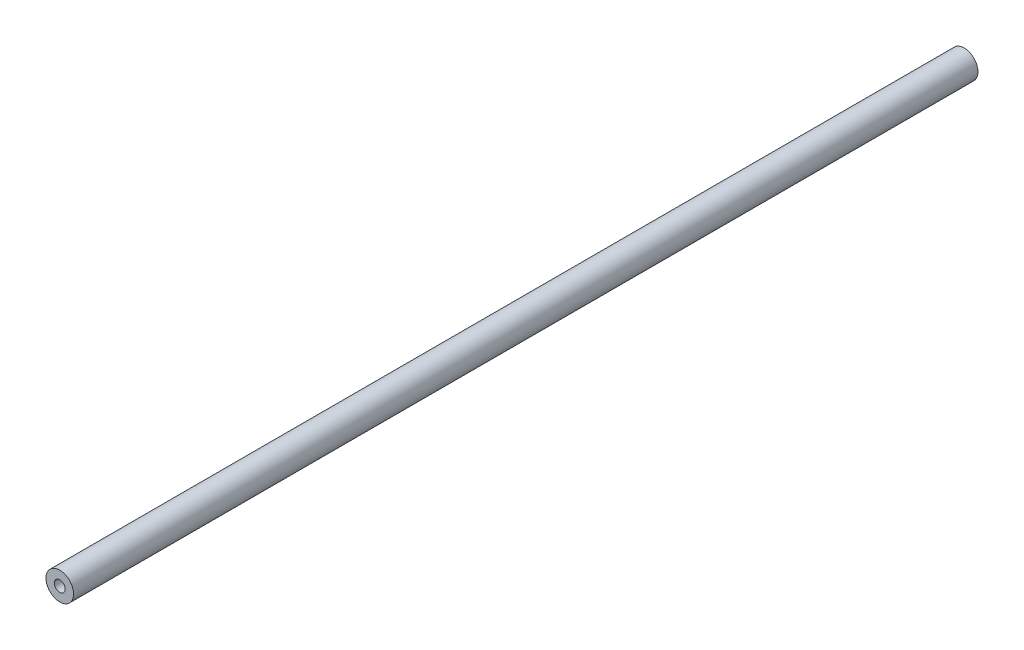
ISO-10303-21;
HEADER;
FILE_DESCRIPTION(('STEP AP214'),'2;1');
FILE_NAME('part.step','',(''),(''),'','','');
FILE_SCHEMA(('AUTOMOTIVE_DESIGN { 1 0 10303 214 1 1 1 1 }'));
ENDSEC;
DATA;
#1=APPLICATION_CONTEXT('core data for automotive mechanical design processes');
#2=APPLICATION_PROTOCOL_DEFINITION('international standard','automotive_design',2000,#1);
#3=PRODUCT_CONTEXT('',#1,'mechanical');
#4=PRODUCT('Part','Part','',(#3));
#5=PRODUCT_RELATED_PRODUCT_CATEGORY('part','',(#4));
#6=PRODUCT_DEFINITION_FORMATION('','',#4);
#7=PRODUCT_DEFINITION_CONTEXT('part definition',#1,'design');
#8=PRODUCT_DEFINITION('design','',#6,#7);
#9=PRODUCT_DEFINITION_SHAPE('','',#8);
#10=(LENGTH_UNIT() NAMED_UNIT(*) SI_UNIT(.MILLI.,.METRE.));
#11=(NAMED_UNIT(*) PLANE_ANGLE_UNIT() SI_UNIT($,.RADIAN.));
#12=(NAMED_UNIT(*) SI_UNIT($,.STERADIAN.) SOLID_ANGLE_UNIT());
#13=UNCERTAINTY_MEASURE_WITH_UNIT(LENGTH_MEASURE(1.E-05),#10,'distance_accuracy_value','');
#14=(GEOMETRIC_REPRESENTATION_CONTEXT(3) GLOBAL_UNCERTAINTY_ASSIGNED_CONTEXT((#13)) GLOBAL_UNIT_ASSIGNED_CONTEXT((#10,
#11,#12)) REPRESENTATION_CONTEXT('',''));
#15=CARTESIAN_POINT('',(0.,0.,0.));
#16=DIRECTION('',(0.,0.,1.));
#17=DIRECTION('',(1.,0.,0.));
#18=AXIS2_PLACEMENT_3D('',#15,#16,#17);
#19=CARTESIAN_POINT('',(0.,0.,416.433));
#20=DIRECTION('',(0.,0.,-1.));
#21=DIRECTION('',(-1.,0.,0.));
#22=AXIS2_PLACEMENT_3D('',#19,#20,#21);
#23=CYLINDRICAL_SURFACE('',#22,6.35);
#24=CARTESIAN_POINT('',(0.,0.,416.433));
#25=DIRECTION('',(0.,0.,1.));
#26=DIRECTION('',(1.,0.,0.));
#27=AXIS2_PLACEMENT_3D('',#24,#25,#26);
#28=CIRCLE('',#27,6.35);
#29=CARTESIAN_POINT('',(6.35,0.,416.433));
#30=VERTEX_POINT('',#29);
#31=EDGE_CURVE('E10',#30,#30,#28,.T.);
#32=ORIENTED_EDGE('',*,*,#31,.F.);
#33=EDGE_LOOP('',(#32));
#34=FACE_BOUND('',#33,.T.);
#35=CARTESIAN_POINT('',(0.,0.,0.));
#36=DIRECTION('',(0.,0.,1.));
#37=DIRECTION('',(1.,0.,0.));
#38=AXIS2_PLACEMENT_3D('',#35,#36,#37);
#39=CIRCLE('',#38,6.35);
#40=CARTESIAN_POINT('',(6.35,0.,0.));
#41=VERTEX_POINT('',#40);
#42=EDGE_CURVE('E34',#41,#41,#39,.T.);
#43=ORIENTED_EDGE('',*,*,#42,.T.);
#44=EDGE_LOOP('',(#43));
#45=FACE_BOUND('',#44,.T.);
#46=ADVANCED_FACE('F31',(#34,#45),#23,.T.);
#47=CARTESIAN_POINT('',(0.,0.,416.433));
#48=DIRECTION('',(0.,0.,1.));
#49=DIRECTION('',(1.,0.,0.));
#50=AXIS2_PLACEMENT_3D('',#47,#48,#49);
#51=PLANE('',#50);
#52=CARTESIAN_POINT('',(0.,0.,416.433));
#53=DIRECTION('',(0.,0.,1.));
#54=DIRECTION('',(1.,0.,0.));
#55=AXIS2_PLACEMENT_3D('',#52,#53,#54);
#56=CIRCLE('',#55,2.5);
#57=CARTESIAN_POINT('',(2.49999999999999,0.,416.433));
#58=VERTEX_POINT('',#57);
#59=EDGE_CURVE('E45',#58,#58,#56,.T.);
#60=ORIENTED_EDGE('',*,*,#59,.F.);
#61=EDGE_LOOP('',(#60));
#62=FACE_BOUND('',#61,.T.);
#63=ORIENTED_EDGE('',*,*,#31,.T.);
#64=EDGE_LOOP('',(#63));
#65=FACE_BOUND('',#64,.T.);
#66=ADVANCED_FACE('F51',(#62,#65),#51,.T.);
#67=CARTESIAN_POINT('',(0.,0.,0.));
#68=DIRECTION('',(0.,0.,1.));
#69=DIRECTION('',(1.,0.,0.));
#70=AXIS2_PLACEMENT_3D('',#67,#68,#69);
#71=PLANE('',#70);
#72=CARTESIAN_POINT('',(0.,0.,0.));
#73=DIRECTION('',(0.,0.,1.));
#74=DIRECTION('',(1.,0.,0.));
#75=AXIS2_PLACEMENT_3D('',#72,#73,#74);
#76=CIRCLE('',#75,2.49999999999995);
#77=CARTESIAN_POINT('',(2.49999999999994,0.,0.));
#78=VERTEX_POINT('',#77);
#79=EDGE_CURVE('E41',#78,#78,#76,.T.);
#80=ORIENTED_EDGE('',*,*,#79,.T.);
#81=EDGE_LOOP('',(#80));
#82=FACE_BOUND('',#81,.T.);
#83=ORIENTED_EDGE('',*,*,#42,.F.);
#84=EDGE_LOOP('',(#83));
#85=FACE_BOUND('',#84,.T.);
#86=ADVANCED_FACE('F53',(#82,#85),#71,.F.);
#87=CARTESIAN_POINT('',(0.,0.,416.433));
#88=DIRECTION('',(0.,0.,1.));
#89=DIRECTION('',(1.,0.,0.));
#90=AXIS2_PLACEMENT_3D('',#87,#88,#89);
#91=CYLINDRICAL_SURFACE('',#90,2.49999999999995);
#92=ORIENTED_EDGE('',*,*,#79,.F.);
#93=EDGE_LOOP('',(#92));
#94=FACE_BOUND('',#93,.T.);
#95=ORIENTED_EDGE('',*,*,#59,.T.);
#96=EDGE_LOOP('',(#95));
#97=FACE_BOUND('',#96,.T.);
#98=ADVANCED_FACE('F49',(#94,#97),#91,.F.);
#99=CLOSED_SHELL('',(#46,#66,#86,#98));
#100=MANIFOLD_SOLID_BREP('B2',#99);
#101=ADVANCED_BREP_SHAPE_REPRESENTATION('',(#18,#100),#14);
#102=SHAPE_DEFINITION_REPRESENTATION(#9,#101);
ENDSEC;
END-ISO-10303-21;
